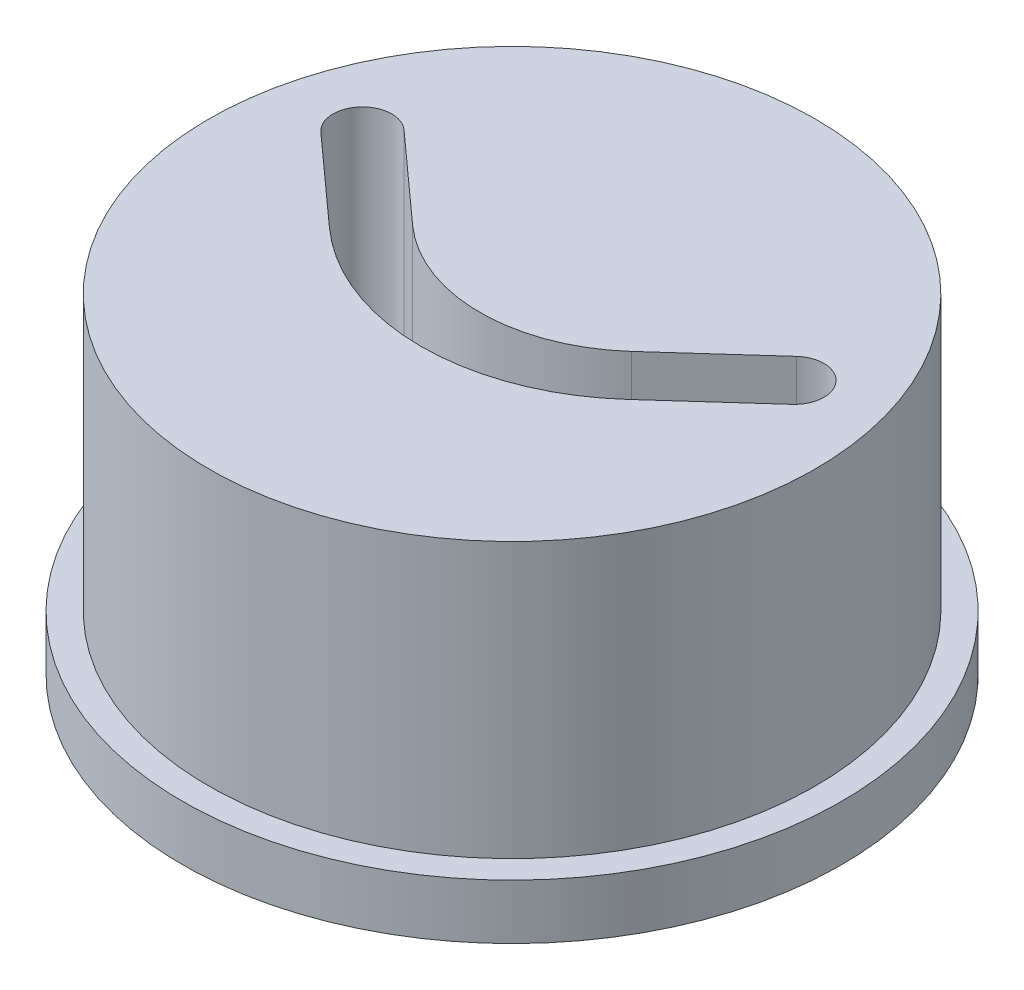
ISO-10303-21;
HEADER;
FILE_DESCRIPTION(('STEP AP214'),'2;1');
FILE_NAME('part.step','',(''),(''),'','','');
FILE_SCHEMA(('AUTOMOTIVE_DESIGN { 1 0 10303 214 1 1 1 1 }'));
ENDSEC;
DATA;
#1=APPLICATION_CONTEXT('core data for automotive mechanical design processes');
#2=APPLICATION_PROTOCOL_DEFINITION('international standard','automotive_design',2000,#1);
#3=PRODUCT_CONTEXT('',#1,'mechanical');
#4=PRODUCT('Part','Part','',(#3));
#5=PRODUCT_RELATED_PRODUCT_CATEGORY('part','',(#4));
#6=PRODUCT_DEFINITION_FORMATION('','',#4);
#7=PRODUCT_DEFINITION_CONTEXT('part definition',#1,'design');
#8=PRODUCT_DEFINITION('design','',#6,#7);
#9=PRODUCT_DEFINITION_SHAPE('','',#8);
#10=(LENGTH_UNIT() NAMED_UNIT(*) SI_UNIT(.MILLI.,.METRE.));
#11=(NAMED_UNIT(*) PLANE_ANGLE_UNIT() SI_UNIT($,.RADIAN.));
#12=(NAMED_UNIT(*) SI_UNIT($,.STERADIAN.) SOLID_ANGLE_UNIT());
#13=UNCERTAINTY_MEASURE_WITH_UNIT(LENGTH_MEASURE(1.E-05),#10,'distance_accuracy_value','');
#14=(GEOMETRIC_REPRESENTATION_CONTEXT(3) GLOBAL_UNCERTAINTY_ASSIGNED_CONTEXT((#13)) GLOBAL_UNIT_ASSIGNED_CONTEXT((#10,
#11,#12)) REPRESENTATION_CONTEXT('',''));
#15=CARTESIAN_POINT('',(0.,0.,0.));
#16=DIRECTION('',(0.,0.,1.));
#17=DIRECTION('',(1.,0.,0.));
#18=AXIS2_PLACEMENT_3D('',#15,#16,#17);
#19=CARTESIAN_POINT('',(-12.4859182363819,19.05,-3.83545340078554));
#20=DIRECTION('',(0.,-1.,0.));
#21=DIRECTION('',(0.,0.,-1.));
#22=AXIS2_PLACEMENT_3D('',#19,#20,#21);
#23=CYLINDRICAL_SURFACE('',#22,0.889000000000001);
#24=DIRECTION('',(0.,-1.,0.));
#25=VECTOR('',#24,1.);
#26=CARTESIAN_POINT('',(-11.8908364727638,19.05,-4.49590680157107));
#27=LINE('',#26,#25);
#28=CARTESIAN_POINT('',(-11.8908364727638,6.35,-4.49590680157107));
#29=VERTEX_POINT('',#28);
#30=CARTESIAN_POINT('',(-11.8908364727639,0.,-4.49590680157107));
#31=VERTEX_POINT('',#30);
#32=EDGE_CURVE('E295',#29,#31,#27,.T.);
#33=ORIENTED_EDGE('',*,*,#32,.F.);
#34=CARTESIAN_POINT('',(-12.4859182363819,6.35,-3.83545340078554));
#35=DIRECTION('',(0.,1.,0.));
#36=DIRECTION('',(0.,0.,1.));
#37=AXIS2_PLACEMENT_3D('',#34,#35,#36);
#38=CIRCLE('',#37,0.889000000000001);
#39=CARTESIAN_POINT('',(-13.081,6.35,-3.175));
#40=VERTEX_POINT('',#39);
#41=EDGE_CURVE('E68',#29,#40,#38,.T.);
#42=ORIENTED_EDGE('',*,*,#41,.T.);
#43=DIRECTION('',(0.,-1.,0.));
#44=VECTOR('',#43,1.);
#45=CARTESIAN_POINT('',(-13.081,19.05,-3.175));
#46=LINE('',#45,#44);
#47=CARTESIAN_POINT('',(-13.081,0.,-3.175));
#48=VERTEX_POINT('',#47);
#49=EDGE_CURVE('E310',#40,#48,#46,.T.);
#50=ORIENTED_EDGE('',*,*,#49,.T.);
#51=CARTESIAN_POINT('',(-12.4859182363819,0.,-3.83545340078554));
#52=DIRECTION('',(0.,1.,0.));
#53=DIRECTION('',(0.,0.,-1.));
#54=AXIS2_PLACEMENT_3D('',#51,#52,#53);
#55=CIRCLE('',#54,0.889000000000001);
#56=EDGE_CURVE('E261',#31,#48,#55,.T.);
#57=ORIENTED_EDGE('',*,*,#56,.F.);
#58=EDGE_LOOP('',(#33,#42,#50,#57));
#59=FACE_BOUND('',#58,.T.);
#60=ADVANCED_FACE('F41',(#59),#23,.F.);
#61=CARTESIAN_POINT('',(-13.081,19.05,-3.175));
#62=DIRECTION('',(0.66938331115646,0.,-0.742917211232324));
#63=DIRECTION('',(-0.742917211232324,0.,-0.66938331115646));
#64=AXIS2_PLACEMENT_3D('',#61,#62,#63);
#65=PLANE('',#64);
#66=ORIENTED_EDGE('',*,*,#49,.F.);
#67=DIRECTION('',(0.742917211232324,0.,0.66938331115646));
#68=VECTOR('',#67,1.);
#69=CARTESIAN_POINT('',(-13.081,6.35,-3.175));
#70=LINE('',#69,#68);
#71=CARTESIAN_POINT('',(-8.05910731299933,6.35,1.34982605635276));
#72=VERTEX_POINT('',#71);
#73=EDGE_CURVE('E250',#40,#72,#70,.T.);
#74=ORIENTED_EDGE('',*,*,#73,.T.);
#75=DIRECTION('',(0.,-1.,0.));
#76=VECTOR('',#75,1.);
#77=CARTESIAN_POINT('',(-8.05910731299933,19.05,1.34982605635276));
#78=LINE('',#77,#76);
#79=CARTESIAN_POINT('',(-8.05910731299933,0.,1.34982605635276));
#80=VERTEX_POINT('',#79);
#81=EDGE_CURVE('E308',#72,#80,#78,.T.);
#82=ORIENTED_EDGE('',*,*,#81,.T.);
#83=DIRECTION('',(0.742917211232324,0.,0.66938331115646));
#84=VECTOR('',#83,1.);
#85=CARTESIAN_POINT('',(-13.081,0.,-3.175));
#86=LINE('',#85,#84);
#87=EDGE_CURVE('E272',#48,#80,#86,.T.);
#88=ORIENTED_EDGE('',*,*,#87,.F.);
#89=EDGE_LOOP('',(#66,#74,#82,#88));
#90=FACE_BOUND('',#89,.T.);
#91=ADVANCED_FACE('F339',(#90),#65,.T.);
#92=CARTESIAN_POINT('',(0.,19.05,-7.59459999999993));
#93=DIRECTION('',(0.,-1.,0.));
#94=DIRECTION('',(0.,0.,-1.));
#95=AXIS2_PLACEMENT_3D('',#92,#93,#94);
#96=CYLINDRICAL_SURFACE('',#95,12.0396);
#97=ORIENTED_EDGE('',*,*,#81,.F.);
#98=CARTESIAN_POINT('',(0.,6.35,-7.59459999999993));
#99=DIRECTION('',(0.,1.,0.));
#100=DIRECTION('',(0.,0.,1.));
#101=AXIS2_PLACEMENT_3D('',#98,#99,#100);
#102=CIRCLE('',#101,12.0396);
#103=CARTESIAN_POINT('',(8.05910731299933,6.35,1.34982605635276));
#104=VERTEX_POINT('',#103);
#105=EDGE_CURVE('E247',#72,#104,#102,.T.);
#106=ORIENTED_EDGE('',*,*,#105,.T.);
#107=DIRECTION('',(0.,-1.,0.));
#108=VECTOR('',#107,1.);
#109=CARTESIAN_POINT('',(8.05910731299933,19.05,1.34982605635276));
#110=LINE('',#109,#108);
#111=CARTESIAN_POINT('',(8.05910731299933,0.,1.34982605635276));
#112=VERTEX_POINT('',#111);
#113=EDGE_CURVE('E306',#104,#112,#110,.T.);
#114=ORIENTED_EDGE('',*,*,#113,.T.);
#115=CARTESIAN_POINT('',(0.,0.,-7.59459999999993));
#116=DIRECTION('',(0.,1.,0.));
#117=DIRECTION('',(0.,0.,1.));
#118=AXIS2_PLACEMENT_3D('',#115,#116,#117);
#119=CIRCLE('',#118,12.0396);
#120=EDGE_CURVE('E276',#80,#112,#119,.T.);
#121=ORIENTED_EDGE('',*,*,#120,.F.);
#122=EDGE_LOOP('',(#97,#106,#114,#121));
#123=FACE_BOUND('',#122,.T.);
#124=ADVANCED_FACE('F345',(#123),#96,.F.);
#125=CARTESIAN_POINT('',(13.081,19.05,-3.175));
#126=DIRECTION('',(-0.66938331115646,0.,-0.742917211232324));
#127=DIRECTION('',(-0.742917211232324,0.,0.66938331115646));
#128=AXIS2_PLACEMENT_3D('',#125,#126,#127);
#129=PLANE('',#128);
#130=ORIENTED_EDGE('',*,*,#113,.F.);
#131=DIRECTION('',(0.742917211232324,0.,-0.66938331115646));
#132=VECTOR('',#131,1.);
#133=CARTESIAN_POINT('',(13.081,6.35,-3.175));
#134=LINE('',#133,#132);
#135=CARTESIAN_POINT('',(13.081,6.35,-3.175));
#136=VERTEX_POINT('',#135);
#137=EDGE_CURVE('E244',#104,#136,#134,.T.);
#138=ORIENTED_EDGE('',*,*,#137,.T.);
#139=DIRECTION('',(0.,-1.,0.));
#140=VECTOR('',#139,1.);
#141=CARTESIAN_POINT('',(13.081,19.05,-3.175));
#142=LINE('',#141,#140);
#143=CARTESIAN_POINT('',(13.081,0.,-3.175));
#144=VERTEX_POINT('',#143);
#145=EDGE_CURVE('E304',#136,#144,#142,.T.);
#146=ORIENTED_EDGE('',*,*,#145,.T.);
#147=DIRECTION('',(0.742917211232324,0.,-0.66938331115646));
#148=VECTOR('',#147,1.);
#149=CARTESIAN_POINT('',(13.081,0.,-3.175));
#150=LINE('',#149,#148);
#151=EDGE_CURVE('E279',#112,#144,#150,.T.);
#152=ORIENTED_EDGE('',*,*,#151,.F.);
#153=EDGE_LOOP('',(#130,#138,#146,#152));
#154=FACE_BOUND('',#153,.T.);
#155=ADVANCED_FACE('F468',(#154),#129,.T.);
#156=CARTESIAN_POINT('',(12.4859182363819,19.05,-3.83545340078554));
#157=DIRECTION('',(0.,-1.,0.));
#158=DIRECTION('',(0.,0.,-1.));
#159=AXIS2_PLACEMENT_3D('',#156,#157,#158);
#160=CYLINDRICAL_SURFACE('',#159,0.889000000000001);
#161=ORIENTED_EDGE('',*,*,#145,.F.);
#162=CARTESIAN_POINT('',(12.4859182363819,6.35,-3.83545340078554));
#163=DIRECTION('',(0.,1.,0.));
#164=DIRECTION('',(0.,0.,1.));
#165=AXIS2_PLACEMENT_3D('',#162,#163,#164);
#166=CIRCLE('',#165,0.889000000000001);
#167=CARTESIAN_POINT('',(11.8908364727638,6.35,-4.49590680157107));
#168=VERTEX_POINT('',#167);
#169=EDGE_CURVE('E241',#136,#168,#166,.T.);
#170=ORIENTED_EDGE('',*,*,#169,.T.);
#171=DIRECTION('',(0.,-1.,0.));
#172=VECTOR('',#171,1.);
#173=CARTESIAN_POINT('',(11.8908364727638,19.05,-4.49590680157107));
#174=LINE('',#173,#172);
#175=CARTESIAN_POINT('',(11.8908364727638,0.,-4.49590680157107));
#176=VERTEX_POINT('',#175);
#177=EDGE_CURVE('E302',#168,#176,#174,.T.);
#178=ORIENTED_EDGE('',*,*,#177,.T.);
#179=CARTESIAN_POINT('',(12.4859182363819,0.,-3.83545340078554));
#180=DIRECTION('',(0.,1.,0.));
#181=DIRECTION('',(0.,0.,-1.));
#182=AXIS2_PLACEMENT_3D('',#179,#180,#181);
#183=CIRCLE('',#182,0.889000000000001);
#184=EDGE_CURVE('E282',#144,#176,#183,.T.);
#185=ORIENTED_EDGE('',*,*,#184,.F.);
#186=EDGE_LOOP('',(#161,#170,#178,#185));
#187=FACE_BOUND('',#186,.T.);
#188=ADVANCED_FACE('F464',(#187),#160,.F.);
#189=CARTESIAN_POINT('',(11.8908364727638,19.05,-4.49590680157107));
#190=DIRECTION('',(0.66938331115646,0.,0.742917211232324));
#191=DIRECTION('',(0.742917211232324,0.,-0.66938331115646));
#192=AXIS2_PLACEMENT_3D('',#189,#190,#191);
#193=PLANE('',#192);
#194=ORIENTED_EDGE('',*,*,#177,.F.);
#195=DIRECTION('',(-0.742917211232324,0.,0.66938331115646));
#196=VECTOR('',#195,1.);
#197=CARTESIAN_POINT('',(11.8908364727638,6.35,-4.49590680157107));
#198=LINE('',#197,#196);
#199=CARTESIAN_POINT('',(6.86894378576314,6.35,0.0289192547816858));
#200=VERTEX_POINT('',#199);
#201=EDGE_CURVE('E238',#168,#200,#198,.T.);
#202=ORIENTED_EDGE('',*,*,#201,.T.);
#203=DIRECTION('',(0.,-1.,0.));
#204=VECTOR('',#203,1.);
#205=CARTESIAN_POINT('',(6.86894378576314,19.05,0.0289192547816858));
#206=LINE('',#205,#204);
#207=CARTESIAN_POINT('',(6.86894378576314,0.,0.0289192547816858));
#208=VERTEX_POINT('',#207);
#209=EDGE_CURVE('E300',#200,#208,#206,.T.);
#210=ORIENTED_EDGE('',*,*,#209,.T.);
#211=DIRECTION('',(-0.742917211232324,0.,0.66938331115646));
#212=VECTOR('',#211,1.);
#213=CARTESIAN_POINT('',(11.8908364727638,0.,-4.49590680157107));
#214=LINE('',#213,#212);
#215=EDGE_CURVE('E285',#176,#208,#214,.T.);
#216=ORIENTED_EDGE('',*,*,#215,.F.);
#217=EDGE_LOOP('',(#194,#202,#210,#216));
#218=FACE_BOUND('',#217,.T.);
#219=ADVANCED_FACE('F461',(#218),#193,.T.);
#220=CARTESIAN_POINT('',(0.,19.05,-7.59459999999993));
#221=DIRECTION('',(0.,-1.,0.));
#222=DIRECTION('',(0.,0.,-1.));
#223=AXIS2_PLACEMENT_3D('',#220,#221,#222);
#224=CYLINDRICAL_SURFACE('',#223,10.2616);
#225=ORIENTED_EDGE('',*,*,#209,.F.);
#226=CARTESIAN_POINT('',(0.,6.35,-7.59459999999993));
#227=DIRECTION('',(0.,1.,0.));
#228=DIRECTION('',(0.,0.,1.));
#229=AXIS2_PLACEMENT_3D('',#226,#227,#228);
#230=CIRCLE('',#229,10.2616);
#231=CARTESIAN_POINT('',(-6.86894378576314,6.35,0.0289192547816867));
#232=VERTEX_POINT('',#231);
#233=EDGE_CURVE('E222',#200,#232,#230,.F.);
#234=ORIENTED_EDGE('',*,*,#233,.T.);
#235=DIRECTION('',(0.,-1.,0.));
#236=VECTOR('',#235,1.);
#237=CARTESIAN_POINT('',(-6.86894378576314,19.05,0.0289192547816876));
#238=LINE('',#237,#236);
#239=CARTESIAN_POINT('',(-6.86894378576314,0.,0.0289192547816876));
#240=VERTEX_POINT('',#239);
#241=EDGE_CURVE('E298',#232,#240,#238,.T.);
#242=ORIENTED_EDGE('',*,*,#241,.T.);
#243=CARTESIAN_POINT('',(0.,0.,-7.59459999999993));
#244=DIRECTION('',(0.,-1.,0.));
#245=DIRECTION('',(0.,0.,1.));
#246=AXIS2_PLACEMENT_3D('',#243,#244,#245);
#247=CIRCLE('',#246,10.2616);
#248=EDGE_CURVE('E288',#208,#240,#247,.T.);
#249=ORIENTED_EDGE('',*,*,#248,.F.);
#250=EDGE_LOOP('',(#225,#234,#242,#249));
#251=FACE_BOUND('',#250,.T.);
#252=ADVANCED_FACE('F452',(#251),#224,.T.);
#253=CARTESIAN_POINT('',(-11.8908364727638,19.05,-4.49590680157107));
#254=DIRECTION('',(-0.669383311156461,0.,0.742917211232324));
#255=DIRECTION('',(0.742917211232324,0.,0.669383311156461));
#256=AXIS2_PLACEMENT_3D('',#253,#254,#255);
#257=PLANE('',#256);
#258=ORIENTED_EDGE('',*,*,#241,.F.);
#259=DIRECTION('',(-0.742917211232324,0.,-0.669383311156461));
#260=VECTOR('',#259,1.);
#261=CARTESIAN_POINT('',(-11.8908364727638,6.35,-4.49590680157107));
#262=LINE('',#261,#260);
#263=EDGE_CURVE('E11',#232,#29,#262,.T.);
#264=ORIENTED_EDGE('',*,*,#263,.T.);
#265=ORIENTED_EDGE('',*,*,#32,.T.);
#266=DIRECTION('',(-0.742917211232324,0.,-0.669383311156461));
#267=VECTOR('',#266,1.);
#268=CARTESIAN_POINT('',(-11.8908364727638,0.,-4.49590680157107));
#269=LINE('',#268,#267);
#270=EDGE_CURVE('E291',#240,#31,#269,.T.);
#271=ORIENTED_EDGE('',*,*,#270,.F.);
#272=EDGE_LOOP('',(#258,#264,#265,#271));
#273=FACE_BOUND('',#272,.T.);
#274=ADVANCED_FACE('F320',(#273),#257,.T.);
#275=CARTESIAN_POINT('',(0.,19.05,0.));
#276=DIRECTION('',(0.,-1.,0.));
#277=DIRECTION('',(0.,0.,-1.));
#278=AXIS2_PLACEMENT_3D('',#275,#276,#277);
#279=CYLINDRICAL_SURFACE('',#278,17.526);
#280=CARTESIAN_POINT('',(0.,19.05,0.));
#281=DIRECTION('',(0.,1.,0.));
#282=DIRECTION('',(0.,0.,1.));
#283=AXIS2_PLACEMENT_3D('',#280,#281,#282);
#284=CIRCLE('',#283,17.526);
#285=CARTESIAN_POINT('',(0.,19.05,-17.526));
#286=VERTEX_POINT('',#285);
#287=EDGE_CURVE('E268',#286,#286,#284,.T.);
#288=CARTESIAN_POINT('',(0.,3.175,0.));
#289=DIRECTION('',(0.,-1.,0.));
#290=DIRECTION('',(0.,0.,-1.));
#291=AXIS2_PLACEMENT_3D('',#288,#289,#290);
#292=CIRCLE('',#291,17.526);
#293=CARTESIAN_POINT('',(0.,3.175,-17.526));
#294=VERTEX_POINT('',#293);
#295=EDGE_CURVE('E50',#294,#294,#292,.T.);
#296=CARTESIAN_POINT('',(0.,19.05,-17.526));
#297=CARTESIAN_POINT('',(0.,18.8846354166667,-17.526));
#298=CARTESIAN_POINT('',(0.,18.7192708333333,-17.526));
#299=CARTESIAN_POINT('',(0.,18.3885416666667,-17.526));
#300=CARTESIAN_POINT('',(0.,18.2231770833333,-17.526));
#301=CARTESIAN_POINT('',(0.,17.8924479166667,-17.526));
#302=CARTESIAN_POINT('',(0.,17.7270833333333,-17.526));
#303=CARTESIAN_POINT('',(0.,17.3963541666667,-17.526));
#304=CARTESIAN_POINT('',(0.,17.2309895833333,-17.526));
#305=CARTESIAN_POINT('',(0.,16.9002604166667,-17.526));
#306=CARTESIAN_POINT('',(0.,16.7348958333333,-17.526));
#307=CARTESIAN_POINT('',(0.,16.4041666666667,-17.526));
#308=CARTESIAN_POINT('',(0.,16.2388020833333,-17.526));
#309=CARTESIAN_POINT('',(0.,15.9080729166667,-17.526));
#310=CARTESIAN_POINT('',(0.,15.7427083333333,-17.526));
#311=CARTESIAN_POINT('',(0.,15.4119791666667,-17.526));
#312=CARTESIAN_POINT('',(0.,15.2466145833333,-17.526));
#313=CARTESIAN_POINT('',(0.,14.9158854166667,-17.526));
#314=CARTESIAN_POINT('',(0.,14.7505208333333,-17.526));
#315=CARTESIAN_POINT('',(0.,14.4197916666667,-17.526));
#316=CARTESIAN_POINT('',(0.,14.2544270833333,-17.526));
#317=CARTESIAN_POINT('',(0.,13.9236979166667,-17.526));
#318=CARTESIAN_POINT('',(0.,13.7583333333333,-17.526));
#319=CARTESIAN_POINT('',(0.,13.4276041666667,-17.526));
#320=CARTESIAN_POINT('',(0.,13.2622395833333,-17.526));
#321=CARTESIAN_POINT('',(0.,12.9315104166667,-17.526));
#322=CARTESIAN_POINT('',(0.,12.7661458333333,-17.526));
#323=CARTESIAN_POINT('',(0.,12.4354166666667,-17.526));
#324=CARTESIAN_POINT('',(0.,12.2700520833333,-17.526));
#325=CARTESIAN_POINT('',(0.,11.9393229166667,-17.526));
#326=CARTESIAN_POINT('',(0.,11.7739583333333,-17.526));
#327=CARTESIAN_POINT('',(0.,11.4432291666667,-17.526));
#328=CARTESIAN_POINT('',(0.,11.2778645833333,-17.526));
#329=CARTESIAN_POINT('',(0.,10.9471354166667,-17.526));
#330=CARTESIAN_POINT('',(0.,10.7817708333333,-17.526));
#331=CARTESIAN_POINT('',(0.,10.4510416666667,-17.526));
#332=CARTESIAN_POINT('',(0.,10.2856770833333,-17.526));
#333=CARTESIAN_POINT('',(0.,9.95494791666667,-17.526));
#334=CARTESIAN_POINT('',(0.,9.78958333333333,-17.526));
#335=CARTESIAN_POINT('',(0.,9.45885416666667,-17.526));
#336=CARTESIAN_POINT('',(0.,9.29348958333333,-17.526));
#337=CARTESIAN_POINT('',(0.,8.96276041666667,-17.526));
#338=CARTESIAN_POINT('',(0.,8.79739583333333,-17.526));
#339=CARTESIAN_POINT('',(0.,8.46666666666667,-17.526));
#340=CARTESIAN_POINT('',(0.,8.30130208333333,-17.526));
#341=CARTESIAN_POINT('',(0.,7.97057291666667,-17.526));
#342=CARTESIAN_POINT('',(0.,7.80520833333333,-17.526));
#343=CARTESIAN_POINT('',(0.,7.47447916666667,-17.526));
#344=CARTESIAN_POINT('',(0.,7.30911458333333,-17.526));
#345=CARTESIAN_POINT('',(0.,6.97838541666667,-17.526));
#346=CARTESIAN_POINT('',(0.,6.81302083333333,-17.526));
#347=CARTESIAN_POINT('',(0.,6.48229166666667,-17.526));
#348=CARTESIAN_POINT('',(0.,6.31692708333333,-17.526));
#349=CARTESIAN_POINT('',(0.,5.98619791666667,-17.526));
#350=CARTESIAN_POINT('',(0.,5.82083333333333,-17.526));
#351=CARTESIAN_POINT('',(0.,5.49010416666667,-17.526));
#352=CARTESIAN_POINT('',(0.,5.32473958333333,-17.526));
#353=CARTESIAN_POINT('',(0.,4.99401041666667,-17.526));
#354=CARTESIAN_POINT('',(0.,4.82864583333333,-17.526));
#355=CARTESIAN_POINT('',(0.,4.49791666666667,-17.526));
#356=CARTESIAN_POINT('',(0.,4.33255208333333,-17.526));
#357=CARTESIAN_POINT('',(0.,4.00182291666667,-17.526));
#358=CARTESIAN_POINT('',(0.,3.83645833333333,-17.526));
#359=CARTESIAN_POINT('',(0.,3.50572916666667,-17.526));
#360=CARTESIAN_POINT('',(0.,3.34036458333334,-17.526));
#361=CARTESIAN_POINT('',(0.,3.175,-17.526));
#362=B_SPLINE_CURVE_WITH_KNOTS('',3,(#296,#297,#298,#299,#300,#301,#302,#303,#304,#305,#306,
#307,#308,#309,#310,#311,#312,#313,#314,#315,#316,#317,#318,#319,#320,#321,#322,#323,#324,#325,
#326,#327,#328,#329,#330,#331,#332,#333,#334,#335,#336,#337,#338,#339,#340,#341,#342,#343,#344,
#345,#346,#347,#348,#349,#350,#351,#352,#353,#354,#355,#356,#357,#358,#359,#360,#361),
.UNSPECIFIED.,.F.,.F.,(4,2,2,2,2,2,2,2,2,2,2,2,2,2,2,2,2,2,2,2,2,2,2,2,2,2,2,2,2,2,2,2,4),(0.,
0.496093750000003,0.992187500000002,1.48828125,1.984375,2.48046875,2.9765625,3.47265625,3.96875,
4.46484375,4.9609375,5.45703125,5.953125,6.44921875,6.9453125,7.44140625,7.9375,8.43359375,
8.9296875,9.42578125,9.921875,10.41796875,10.9140625,11.41015625,11.90625,12.40234375,
12.8984375,13.39453125,13.890625,14.38671875,14.8828125,15.37890625,15.875),.UNSPECIFIED.);
#363=EDGE_CURVE('BSEAM43',#286,#294,#362,.T.);
#364=ORIENTED_EDGE('',*,*,#287,.F.);
#365=ORIENTED_EDGE('',*,*,#295,.F.);
#366=ORIENTED_EDGE('',*,*,#363,.T.);
#367=ORIENTED_EDGE('',*,*,#363,.F.);
#368=EDGE_LOOP('',(#364,#366,#365,#367));
#369=FACE_BOUND('',#368,.T.);
#370=ADVANCED_FACE('F43',(#369),#279,.T.);
#371=CARTESIAN_POINT('',(0.,19.05,0.));
#372=DIRECTION('',(0.,1.,0.));
#373=DIRECTION('',(0.,0.,1.));
#374=AXIS2_PLACEMENT_3D('',#371,#372,#373);
#375=PLANE('',#374);
#376=CARTESIAN_POINT('',(12.4859182363819,19.05,-3.83545340078554));
#377=DIRECTION('',(0.,1.,0.));
#378=DIRECTION('',(0.,0.,1.));
#379=AXIS2_PLACEMENT_3D('',#376,#377,#378);
#380=CIRCLE('',#379,1.7018);
#381=CARTESIAN_POINT('',(13.625074755308,19.05,-2.57115689071037));
#382=VERTEX_POINT('',#381);
#383=CARTESIAN_POINT('',(11.3467617174559,19.05,-5.09974991086071));
#384=VERTEX_POINT('',#383);
#385=EDGE_CURVE('E57',#382,#384,#380,.T.);
#386=ORIENTED_EDGE('',*,*,#385,.F.);
#387=DIRECTION('',(0.742917211232324,0.,-0.66938331115646));
#388=VECTOR('',#387,1.);
#389=CARTESIAN_POINT('',(8.6031820683073,19.05,1.95366916564239));
#390=LINE('',#389,#388);
#391=CARTESIAN_POINT('',(8.6031820683073,19.05,1.95366916564239));
#392=VERTEX_POINT('',#391);
#393=EDGE_CURVE('E181',#392,#382,#390,.T.);
#394=ORIENTED_EDGE('',*,*,#393,.F.);
#395=CARTESIAN_POINT('',(0.,19.05,-7.59459999999993));
#396=DIRECTION('',(0.,1.,0.));
#397=DIRECTION('',(0.,0.,1.));
#398=AXIS2_PLACEMENT_3D('',#395,#396,#397);
#399=CIRCLE('',#398,12.8524);
#400=CARTESIAN_POINT('',(-8.6031820683073,19.05,1.95366916564239));
#401=VERTEX_POINT('',#400);
#402=EDGE_CURVE('E184',#401,#392,#399,.T.);
#403=ORIENTED_EDGE('',*,*,#402,.F.);
#404=DIRECTION('',(0.742917211232324,0.,0.66938331115646));
#405=VECTOR('',#404,1.);
#406=CARTESIAN_POINT('',(-13.625074755308,19.05,-2.57115689071037));
#407=LINE('',#406,#405);
#408=CARTESIAN_POINT('',(-13.625074755308,19.05,-2.57115689071037));
#409=VERTEX_POINT('',#408);
#410=EDGE_CURVE('E215',#409,#401,#407,.T.);
#411=ORIENTED_EDGE('',*,*,#410,.F.);
#412=CARTESIAN_POINT('',(-12.4859182363819,19.05,-3.83545340078554));
#413=DIRECTION('',(0.,1.,0.));
#414=DIRECTION('',(0.,0.,1.));
#415=AXIS2_PLACEMENT_3D('',#412,#413,#414);
#416=CIRCLE('',#415,1.7018);
#417=CARTESIAN_POINT('',(-11.3467617174559,19.05,-5.09974991086071));
#418=VERTEX_POINT('',#417);
#419=EDGE_CURVE('E212',#418,#409,#416,.T.);
#420=ORIENTED_EDGE('',*,*,#419,.F.);
#421=DIRECTION('',(-0.742917211232324,0.,-0.669383311156461));
#422=VECTOR('',#421,1.);
#423=CARTESIAN_POINT('',(-6.32486903045517,19.05,-0.574923854507948));
#424=LINE('',#423,#422);
#425=CARTESIAN_POINT('',(-6.32486903045517,19.05,-0.574923854507948));
#426=VERTEX_POINT('',#425);
#427=EDGE_CURVE('E209',#426,#418,#424,.T.);
#428=ORIENTED_EDGE('',*,*,#427,.F.);
#429=CARTESIAN_POINT('',(0.,19.05,-7.59459999999993));
#430=DIRECTION('',(0.,-1.,0.));
#431=DIRECTION('',(0.,0.,1.));
#432=AXIS2_PLACEMENT_3D('',#429,#430,#431);
#433=CIRCLE('',#432,9.44880000000001);
#434=CARTESIAN_POINT('',(6.32486903045518,19.05,-0.574923854507948));
#435=VERTEX_POINT('',#434);
#436=EDGE_CURVE('E206',#435,#426,#433,.T.);
#437=ORIENTED_EDGE('',*,*,#436,.F.);
#438=DIRECTION('',(-0.742917211232324,0.,0.669383311156461));
#439=VECTOR('',#438,1.);
#440=CARTESIAN_POINT('',(11.3467617174559,19.05,-5.09974991086071));
#441=LINE('',#440,#439);
#442=EDGE_CURVE('E204',#384,#435,#441,.T.);
#443=ORIENTED_EDGE('',*,*,#442,.F.);
#444=EDGE_LOOP('',(#386,#394,#403,#411,#420,#428,#437,#443));
#445=FACE_BOUND('',#444,.T.);
#446=ORIENTED_EDGE('',*,*,#287,.T.);
#447=EDGE_LOOP('',(#446));
#448=FACE_BOUND('',#447,.T.);
#449=ADVANCED_FACE('F316',(#445,#448),#375,.T.);
#450=CARTESIAN_POINT('',(0.,0.,0.));
#451=DIRECTION('',(0.,1.,0.));
#452=DIRECTION('',(0.,0.,1.));
#453=AXIS2_PLACEMENT_3D('',#450,#451,#452);
#454=PLANE('',#453);
#455=ORIENTED_EDGE('',*,*,#56,.T.);
#456=ORIENTED_EDGE('',*,*,#87,.T.);
#457=ORIENTED_EDGE('',*,*,#120,.T.);
#458=ORIENTED_EDGE('',*,*,#151,.T.);
#459=ORIENTED_EDGE('',*,*,#184,.T.);
#460=ORIENTED_EDGE('',*,*,#215,.T.);
#461=ORIENTED_EDGE('',*,*,#248,.T.);
#462=ORIENTED_EDGE('',*,*,#270,.T.);
#463=EDGE_LOOP('',(#455,#456,#457,#458,#459,#460,#461,#462));
#464=FACE_BOUND('',#463,.T.);
#465=CARTESIAN_POINT('',(0.,0.,0.));
#466=DIRECTION('',(0.,-1.,0.));
#467=DIRECTION('',(0.,0.,-1.));
#468=AXIS2_PLACEMENT_3D('',#465,#466,#467);
#469=CIRCLE('',#468,19.05);
#470=CARTESIAN_POINT('',(0.,0.,-19.05));
#471=VERTEX_POINT('',#470);
#472=EDGE_CURVE('E256',#471,#471,#469,.T.);
#473=ORIENTED_EDGE('',*,*,#472,.T.);
#474=EDGE_LOOP('',(#473));
#475=FACE_BOUND('',#474,.T.);
#476=ADVANCED_FACE('F326',(#464,#475),#454,.F.);
#477=CARTESIAN_POINT('',(0.,3.175,0.));
#478=DIRECTION('',(0.,-1.,0.));
#479=DIRECTION('',(0.,0.,-1.));
#480=AXIS2_PLACEMENT_3D('',#477,#478,#479);
#481=PLANE('',#480);
#482=CARTESIAN_POINT('',(0.,3.175,0.));
#483=DIRECTION('',(0.,-1.,0.));
#484=DIRECTION('',(0.,0.,-1.));
#485=AXIS2_PLACEMENT_3D('',#482,#483,#484);
#486=CIRCLE('',#485,19.05);
#487=CARTESIAN_POINT('',(0.,3.175,-19.05));
#488=VERTEX_POINT('',#487);
#489=EDGE_CURVE('E257',#488,#488,#486,.T.);
#490=ORIENTED_EDGE('',*,*,#489,.F.);
#491=EDGE_LOOP('',(#490));
#492=FACE_BOUND('',#491,.T.);
#493=ORIENTED_EDGE('',*,*,#295,.T.);
#494=EDGE_LOOP('',(#493));
#495=FACE_BOUND('',#494,.T.);
#496=ADVANCED_FACE('F323',(#492,#495),#481,.F.);
#497=CARTESIAN_POINT('',(0.,3.175,0.));
#498=DIRECTION('',(0.,-1.,0.));
#499=DIRECTION('',(0.,0.,-1.));
#500=AXIS2_PLACEMENT_3D('',#497,#498,#499);
#501=CYLINDRICAL_SURFACE('',#500,19.05);
#502=ORIENTED_EDGE('',*,*,#489,.T.);
#503=EDGE_LOOP('',(#502));
#504=FACE_BOUND('',#503,.T.);
#505=ORIENTED_EDGE('',*,*,#472,.F.);
#506=EDGE_LOOP('',(#505));
#507=FACE_BOUND('',#506,.T.);
#508=ADVANCED_FACE('F325',(#504,#507),#501,.T.);
#509=CARTESIAN_POINT('',(12.4859182363819,6.35,-3.83545340078554));
#510=DIRECTION('',(0.,1.,0.));
#511=DIRECTION('',(0.,0.,1.));
#512=AXIS2_PLACEMENT_3D('',#509,#510,#511);
#513=CYLINDRICAL_SURFACE('',#512,1.7018);
#514=ORIENTED_EDGE('',*,*,#385,.T.);
#515=DIRECTION('',(0.,1.,0.));
#516=VECTOR('',#515,1.);
#517=CARTESIAN_POINT('',(11.3467617174559,6.35,-5.09974991086071));
#518=LINE('',#517,#516);
#519=CARTESIAN_POINT('',(11.3467617174559,6.35,-5.09974991086071));
#520=VERTEX_POINT('',#519);
#521=EDGE_CURVE('E158',#520,#384,#518,.T.);
#522=ORIENTED_EDGE('',*,*,#521,.F.);
#523=CARTESIAN_POINT('',(12.4859182363819,6.35,-3.83545340078554));
#524=DIRECTION('',(0.,1.,0.));
#525=DIRECTION('',(0.,0.,1.));
#526=AXIS2_PLACEMENT_3D('',#523,#524,#525);
#527=CIRCLE('',#526,1.7018);
#528=CARTESIAN_POINT('',(13.625074755308,6.35,-2.57115689071037));
#529=VERTEX_POINT('',#528);
#530=EDGE_CURVE('E162',#529,#520,#527,.T.);
#531=ORIENTED_EDGE('',*,*,#530,.F.);
#532=DIRECTION('',(0.,1.,0.));
#533=VECTOR('',#532,1.);
#534=CARTESIAN_POINT('',(13.625074755308,6.35,-2.57115689071037));
#535=LINE('',#534,#533);
#536=EDGE_CURVE('E220',#529,#382,#535,.T.);
#537=ORIENTED_EDGE('',*,*,#536,.T.);
#538=EDGE_LOOP('',(#514,#522,#531,#537));
#539=FACE_BOUND('',#538,.T.);
#540=ADVANCED_FACE('F160',(#539),#513,.F.);
#541=CARTESIAN_POINT('',(8.6031820683073,6.35,1.95366916564239));
#542=DIRECTION('',(0.66938331115646,0.,0.742917211232324));
#543=DIRECTION('',(0.742917211232324,0.,-0.66938331115646));
#544=AXIS2_PLACEMENT_3D('',#541,#542,#543);
#545=PLANE('',#544);
#546=ORIENTED_EDGE('',*,*,#393,.T.);
#547=ORIENTED_EDGE('',*,*,#536,.F.);
#548=DIRECTION('',(0.742917211232324,0.,-0.66938331115646));
#549=VECTOR('',#548,1.);
#550=CARTESIAN_POINT('',(8.6031820683073,6.35,1.95366916564239));
#551=LINE('',#550,#549);
#552=CARTESIAN_POINT('',(8.6031820683073,6.35,1.95366916564239));
#553=VERTEX_POINT('',#552);
#554=EDGE_CURVE('E168',#553,#529,#551,.T.);
#555=ORIENTED_EDGE('',*,*,#554,.F.);
#556=DIRECTION('',(0.,1.,0.));
#557=VECTOR('',#556,1.);
#558=CARTESIAN_POINT('',(8.6031820683073,6.35,1.95366916564239));
#559=LINE('',#558,#557);
#560=EDGE_CURVE('E223',#553,#392,#559,.T.);
#561=ORIENTED_EDGE('',*,*,#560,.T.);
#562=EDGE_LOOP('',(#546,#547,#555,#561));
#563=FACE_BOUND('',#562,.T.);
#564=ADVANCED_FACE('F375',(#563),#545,.F.);
#565=CARTESIAN_POINT('',(0.,6.35,-7.59459999999993));
#566=DIRECTION('',(0.,1.,0.));
#567=DIRECTION('',(0.,0.,1.));
#568=AXIS2_PLACEMENT_3D('',#565,#566,#567);
#569=CYLINDRICAL_SURFACE('',#568,12.8524);
#570=ORIENTED_EDGE('',*,*,#402,.T.);
#571=ORIENTED_EDGE('',*,*,#560,.F.);
#572=CARTESIAN_POINT('',(0.,6.35,-7.59459999999993));
#573=DIRECTION('',(0.,1.,0.));
#574=DIRECTION('',(0.,0.,1.));
#575=AXIS2_PLACEMENT_3D('',#572,#573,#574);
#576=CIRCLE('',#575,12.8524);
#577=CARTESIAN_POINT('',(-8.6031820683073,6.35,1.95366916564239));
#578=VERTEX_POINT('',#577);
#579=EDGE_CURVE('E200',#578,#553,#576,.T.);
#580=ORIENTED_EDGE('',*,*,#579,.F.);
#581=DIRECTION('',(0.,1.,0.));
#582=VECTOR('',#581,1.);
#583=CARTESIAN_POINT('',(-8.6031820683073,6.35,1.95366916564239));
#584=LINE('',#583,#582);
#585=EDGE_CURVE('E225',#578,#401,#584,.T.);
#586=ORIENTED_EDGE('',*,*,#585,.T.);
#587=EDGE_LOOP('',(#570,#571,#580,#586));
#588=FACE_BOUND('',#587,.T.);
#589=ADVANCED_FACE('F376',(#588),#569,.F.);
#590=CARTESIAN_POINT('',(-13.625074755308,6.35,-2.57115689071037));
#591=DIRECTION('',(-0.66938331115646,0.,0.742917211232324));
#592=DIRECTION('',(0.742917211232324,0.,0.66938331115646));
#593=AXIS2_PLACEMENT_3D('',#590,#591,#592);
#594=PLANE('',#593);
#595=ORIENTED_EDGE('',*,*,#410,.T.);
#596=ORIENTED_EDGE('',*,*,#585,.F.);
#597=DIRECTION('',(0.742917211232324,0.,0.66938331115646));
#598=VECTOR('',#597,1.);
#599=CARTESIAN_POINT('',(-13.625074755308,6.35,-2.57115689071037));
#600=LINE('',#599,#598);
#601=CARTESIAN_POINT('',(-13.625074755308,6.35,-2.57115689071037));
#602=VERTEX_POINT('',#601);
#603=EDGE_CURVE('E196',#602,#578,#600,.T.);
#604=ORIENTED_EDGE('',*,*,#603,.F.);
#605=DIRECTION('',(0.,1.,0.));
#606=VECTOR('',#605,1.);
#607=CARTESIAN_POINT('',(-13.625074755308,6.35,-2.57115689071037));
#608=LINE('',#607,#606);
#609=EDGE_CURVE('E227',#602,#409,#608,.T.);
#610=ORIENTED_EDGE('',*,*,#609,.T.);
#611=EDGE_LOOP('',(#595,#596,#604,#610));
#612=FACE_BOUND('',#611,.T.);
#613=ADVANCED_FACE('F371',(#612),#594,.F.);
#614=CARTESIAN_POINT('',(-12.4859182363819,6.35,-3.83545340078554));
#615=DIRECTION('',(0.,1.,0.));
#616=DIRECTION('',(0.,0.,1.));
#617=AXIS2_PLACEMENT_3D('',#614,#615,#616);
#618=CYLINDRICAL_SURFACE('',#617,1.7018);
#619=ORIENTED_EDGE('',*,*,#419,.T.);
#620=ORIENTED_EDGE('',*,*,#609,.F.);
#621=CARTESIAN_POINT('',(-12.4859182363819,6.35,-3.83545340078554));
#622=DIRECTION('',(0.,1.,0.));
#623=DIRECTION('',(0.,0.,1.));
#624=AXIS2_PLACEMENT_3D('',#621,#622,#623);
#625=CIRCLE('',#624,1.7018);
#626=CARTESIAN_POINT('',(-11.3467617174559,6.35,-5.09974991086071));
#627=VERTEX_POINT('',#626);
#628=EDGE_CURVE('E192',#627,#602,#625,.T.);
#629=ORIENTED_EDGE('',*,*,#628,.F.);
#630=DIRECTION('',(0.,1.,0.));
#631=VECTOR('',#630,1.);
#632=CARTESIAN_POINT('',(-11.3467617174559,6.35,-5.09974991086071));
#633=LINE('',#632,#631);
#634=EDGE_CURVE('E230',#627,#418,#633,.T.);
#635=ORIENTED_EDGE('',*,*,#634,.T.);
#636=EDGE_LOOP('',(#619,#620,#629,#635));
#637=FACE_BOUND('',#636,.T.);
#638=ADVANCED_FACE('F367',(#637),#618,.F.);
#639=CARTESIAN_POINT('',(-6.32486903045517,6.35,-0.574923854507948));
#640=DIRECTION('',(0.669383311156461,0.,-0.742917211232324));
#641=DIRECTION('',(-0.742917211232324,0.,-0.669383311156461));
#642=AXIS2_PLACEMENT_3D('',#639,#640,#641);
#643=PLANE('',#642);
#644=ORIENTED_EDGE('',*,*,#427,.T.);
#645=ORIENTED_EDGE('',*,*,#634,.F.);
#646=DIRECTION('',(-0.742917211232324,0.,-0.669383311156461));
#647=VECTOR('',#646,1.);
#648=CARTESIAN_POINT('',(-6.32486903045517,6.35,-0.574923854507948));
#649=LINE('',#648,#647);
#650=CARTESIAN_POINT('',(-6.32486903045517,6.35,-0.574923854507948));
#651=VERTEX_POINT('',#650);
#652=EDGE_CURVE('E188',#651,#627,#649,.T.);
#653=ORIENTED_EDGE('',*,*,#652,.F.);
#654=DIRECTION('',(0.,1.,0.));
#655=VECTOR('',#654,1.);
#656=CARTESIAN_POINT('',(-6.32486903045517,6.35,-0.574923854507948));
#657=LINE('',#656,#655);
#658=EDGE_CURVE('E233',#651,#426,#657,.T.);
#659=ORIENTED_EDGE('',*,*,#658,.T.);
#660=EDGE_LOOP('',(#644,#645,#653,#659));
#661=FACE_BOUND('',#660,.T.);
#662=ADVANCED_FACE('F365',(#661),#643,.F.);
#663=CARTESIAN_POINT('',(0.,6.35,-7.59459999999993));
#664=DIRECTION('',(0.,1.,0.));
#665=DIRECTION('',(0.,0.,1.));
#666=AXIS2_PLACEMENT_3D('',#663,#664,#665);
#667=CYLINDRICAL_SURFACE('',#666,9.44880000000001);
#668=ORIENTED_EDGE('',*,*,#436,.T.);
#669=ORIENTED_EDGE('',*,*,#658,.F.);
#670=CARTESIAN_POINT('',(0.,6.35,-7.59459999999993));
#671=DIRECTION('',(0.,-1.,0.));
#672=DIRECTION('',(0.,0.,1.));
#673=AXIS2_PLACEMENT_3D('',#670,#671,#672);
#674=CIRCLE('',#673,9.44880000000001);
#675=CARTESIAN_POINT('',(6.32486903045518,6.35,-0.574923854507948));
#676=VERTEX_POINT('',#675);
#677=EDGE_CURVE('E176',#676,#651,#674,.T.);
#678=ORIENTED_EDGE('',*,*,#677,.F.);
#679=DIRECTION('',(0.,1.,0.));
#680=VECTOR('',#679,1.);
#681=CARTESIAN_POINT('',(6.32486903045518,6.35,-0.574923854507948));
#682=LINE('',#681,#680);
#683=EDGE_CURVE('E167',#676,#435,#682,.T.);
#684=ORIENTED_EDGE('',*,*,#683,.T.);
#685=EDGE_LOOP('',(#668,#669,#678,#684));
#686=FACE_BOUND('',#685,.T.);
#687=ADVANCED_FACE('F361',(#686),#667,.T.);
#688=CARTESIAN_POINT('',(11.3467617174559,6.35,-5.09974991086071));
#689=DIRECTION('',(-0.669383311156461,0.,-0.742917211232324));
#690=DIRECTION('',(-0.742917211232324,0.,0.669383311156461));
#691=AXIS2_PLACEMENT_3D('',#688,#689,#690);
#692=PLANE('',#691);
#693=ORIENTED_EDGE('',*,*,#442,.T.);
#694=ORIENTED_EDGE('',*,*,#683,.F.);
#695=DIRECTION('',(-0.742917211232324,0.,0.669383311156461));
#696=VECTOR('',#695,1.);
#697=CARTESIAN_POINT('',(11.3467617174559,6.35,-5.09974991086071));
#698=LINE('',#697,#696);
#699=EDGE_CURVE('E171',#520,#676,#698,.T.);
#700=ORIENTED_EDGE('',*,*,#699,.F.);
#701=ORIENTED_EDGE('',*,*,#521,.T.);
#702=EDGE_LOOP('',(#693,#694,#700,#701));
#703=FACE_BOUND('',#702,.T.);
#704=ADVANCED_FACE('F172',(#703),#692,.F.);
#705=CARTESIAN_POINT('',(12.4859182363819,6.35,-3.83545340078554));
#706=DIRECTION('',(0.,1.,0.));
#707=DIRECTION('',(0.,0.,1.));
#708=AXIS2_PLACEMENT_3D('',#705,#706,#707);
#709=PLANE('',#708);
#710=ORIENTED_EDGE('',*,*,#263,.F.);
#711=ORIENTED_EDGE('',*,*,#233,.F.);
#712=ORIENTED_EDGE('',*,*,#201,.F.);
#713=ORIENTED_EDGE('',*,*,#169,.F.);
#714=ORIENTED_EDGE('',*,*,#137,.F.);
#715=ORIENTED_EDGE('',*,*,#105,.F.);
#716=ORIENTED_EDGE('',*,*,#73,.F.);
#717=ORIENTED_EDGE('',*,*,#41,.F.);
#718=EDGE_LOOP('',(#710,#711,#712,#713,#714,#715,#716,#717));
#719=FACE_BOUND('',#718,.T.);
#720=ORIENTED_EDGE('',*,*,#530,.T.);
#721=ORIENTED_EDGE('',*,*,#699,.T.);
#722=ORIENTED_EDGE('',*,*,#677,.T.);
#723=ORIENTED_EDGE('',*,*,#652,.T.);
#724=ORIENTED_EDGE('',*,*,#628,.T.);
#725=ORIENTED_EDGE('',*,*,#603,.T.);
#726=ORIENTED_EDGE('',*,*,#579,.T.);
#727=ORIENTED_EDGE('',*,*,#554,.T.);
#728=EDGE_LOOP('',(#720,#721,#722,#723,#724,#725,#726,#727));
#729=FACE_BOUND('',#728,.T.);
#730=ADVANCED_FACE('F178',(#719,#729),#709,.T.);
#731=CLOSED_SHELL('',(#60,#91,#124,#155,#188,#219,#252,#274,#370,#449,#476,#496,#508,#540,#564,
#589,#613,#638,#662,#687,#704,#730));
#732=MANIFOLD_SOLID_BREP('B2',#731);
#733=ADVANCED_BREP_SHAPE_REPRESENTATION('',(#18,#732),#14);
#734=SHAPE_DEFINITION_REPRESENTATION(#9,#733);
ENDSEC;
END-ISO-10303-21;
